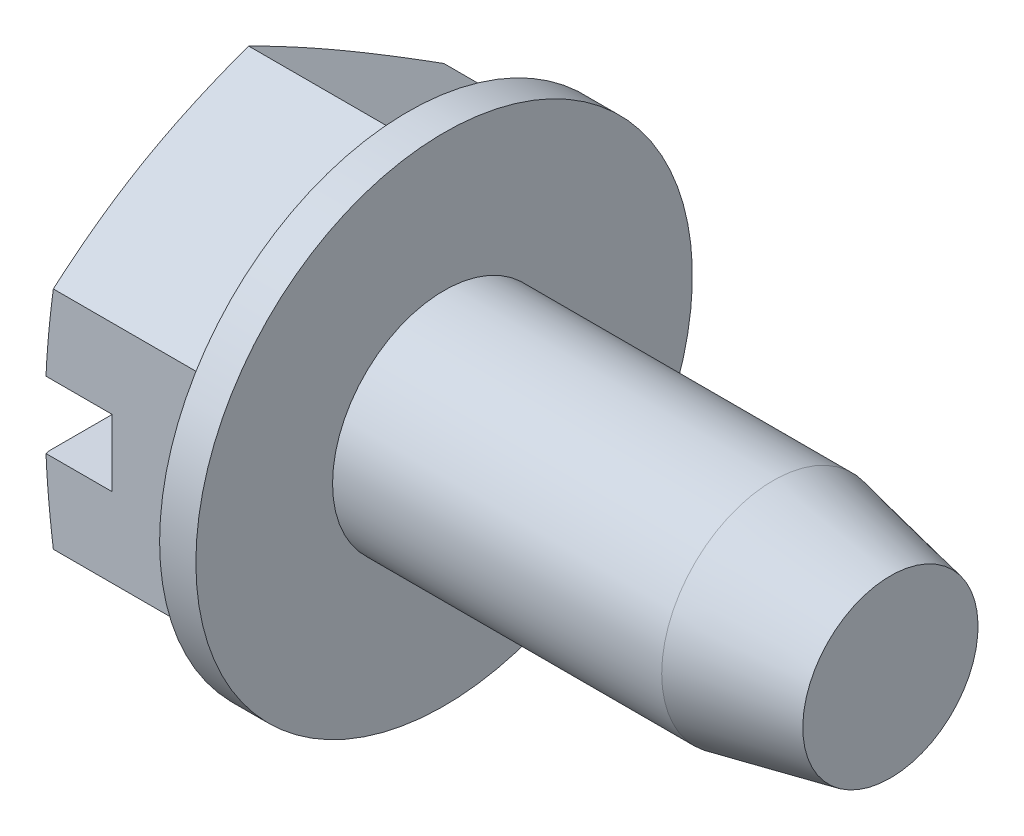
ISO-10303-21;
HEADER;
FILE_DESCRIPTION(('STEP AP214'),'2;1');
FILE_NAME('part.step','',(''),(''),'','','');
FILE_SCHEMA(('AUTOMOTIVE_DESIGN { 1 0 10303 214 1 1 1 1 }'));
ENDSEC;
DATA;
#1=APPLICATION_CONTEXT('core data for automotive mechanical design processes');
#2=APPLICATION_PROTOCOL_DEFINITION('international standard','automotive_design',2000,#1);
#3=PRODUCT_CONTEXT('',#1,'mechanical');
#4=PRODUCT('Part','Part','',(#3));
#5=PRODUCT_RELATED_PRODUCT_CATEGORY('part','',(#4));
#6=PRODUCT_DEFINITION_FORMATION('','',#4);
#7=PRODUCT_DEFINITION_CONTEXT('part definition',#1,'design');
#8=PRODUCT_DEFINITION('design','',#6,#7);
#9=PRODUCT_DEFINITION_SHAPE('','',#8);
#10=(LENGTH_UNIT() NAMED_UNIT(*) SI_UNIT(.MILLI.,.METRE.));
#11=(NAMED_UNIT(*) PLANE_ANGLE_UNIT() SI_UNIT($,.RADIAN.));
#12=(NAMED_UNIT(*) SI_UNIT($,.STERADIAN.) SOLID_ANGLE_UNIT());
#13=UNCERTAINTY_MEASURE_WITH_UNIT(LENGTH_MEASURE(1.E-05),#10,'distance_accuracy_value','');
#14=(GEOMETRIC_REPRESENTATION_CONTEXT(3) GLOBAL_UNCERTAINTY_ASSIGNED_CONTEXT((#13)) GLOBAL_UNIT_ASSIGNED_CONTEXT((#10,
#11,#12)) REPRESENTATION_CONTEXT('',''));
#15=CARTESIAN_POINT('',(0.,0.,0.));
#16=DIRECTION('',(0.,0.,1.));
#17=DIRECTION('',(1.,0.,0.));
#18=AXIS2_PLACEMENT_3D('',#15,#16,#17);
#19=CARTESIAN_POINT('',(-2.45,0.,0.));
#20=DIRECTION('',(-1.,0.,0.));
#21=DIRECTION('',(0.,0.,1.));
#22=AXIS2_PLACEMENT_3D('',#19,#20,#21);
#23=PLANE('',#22);
#24=DIRECTION('',(0.,0.,1.));
#25=VECTOR('',#24,1.);
#26=CARTESIAN_POINT('',(-2.45,0.6,4.));
#27=LINE('',#26,#25);
#28=CARTESIAN_POINT('',(-2.45,0.6,3.5));
#29=VERTEX_POINT('',#28);
#30=CARTESIAN_POINT('',(-2.45,0.6,-3.5));
#31=VERTEX_POINT('',#30);
#32=EDGE_CURVE('E132',#29,#31,#27,.F.);
#33=ORIENTED_EDGE('',*,*,#32,.T.);
#34=DIRECTION('',(0.,1.,0.));
#35=VECTOR('',#34,1.);
#36=CARTESIAN_POINT('',(-2.45,0.,-3.5));
#37=LINE('',#36,#35);
#38=CARTESIAN_POINT('',(-2.45,-0.6,-3.5));
#39=VERTEX_POINT('',#38);
#40=EDGE_CURVE('E127',#31,#39,#37,.F.);
#41=ORIENTED_EDGE('',*,*,#40,.T.);
#42=DIRECTION('',(0.,0.,-1.));
#43=VECTOR('',#42,1.);
#44=CARTESIAN_POINT('',(-2.45,-0.6,-4.));
#45=LINE('',#44,#43);
#46=CARTESIAN_POINT('',(-2.45,-0.6,3.5));
#47=VERTEX_POINT('',#46);
#48=EDGE_CURVE('E395',#39,#47,#45,.F.);
#49=ORIENTED_EDGE('',*,*,#48,.T.);
#50=DIRECTION('',(0.,1.,0.));
#51=VECTOR('',#50,1.);
#52=CARTESIAN_POINT('',(-2.45,0.,3.5));
#53=LINE('',#52,#51);
#54=EDGE_CURVE('E403',#47,#29,#53,.T.);
#55=ORIENTED_EDGE('',*,*,#54,.T.);
#56=EDGE_LOOP('',(#33,#41,#49,#55));
#57=FACE_BOUND('',#56,.T.);
#58=ADVANCED_FACE('F17',(#57),#23,.T.);
#59=CARTESIAN_POINT('',(-2.45,0.6,4.));
#60=DIRECTION('',(0.,1.,0.));
#61=DIRECTION('',(0.,0.,1.));
#62=AXIS2_PLACEMENT_3D('',#59,#60,#61);
#63=PLANE('',#62);
#64=CARTESIAN_POINT('',(-3.64999999998839,0.6,3.44818792990551));
#65=CARTESIAN_POINT('',(-3.6477203832953,0.6,3.45682339648026));
#66=CARTESIAN_POINT('',(-3.64544053641155,0.6,3.46545880227545));
#67=CARTESIAN_POINT('',(-3.64088038226275,0.6,3.48272949230663));
#68=CARTESIAN_POINT('',(-3.63860007499771,0.6,3.49136477654262));
#69=CARTESIAN_POINT('',(-3.636319537542,0.6,3.49999999999905));
#70=B_SPLINE_CURVE_WITH_KNOTS('',3,(#64,#65,#66,#67,#68,#69),.UNSPECIFIED.,.F.,.F.,(4,2,4),(0.,
0.0267938689917817,0.053587737983288),.UNSPECIFIED.);
#71=CARTESIAN_POINT('',(-3.64999999999083,0.6,3.44818792989627));
#72=VERTEX_POINT('',#71);
#73=CARTESIAN_POINT('',(-3.63631953754188,0.599999999999913,3.49999999999953));
#74=VERTEX_POINT('',#73);
#75=EDGE_CURVE('E148',#72,#74,#70,.T.);
#76=ORIENTED_EDGE('',*,*,#75,.F.);
#77=DIRECTION('',(0.,0.,-1.));
#78=VECTOR('',#77,1.);
#79=CARTESIAN_POINT('',(-3.65,0.6,0.));
#80=LINE('',#79,#78);
#81=CARTESIAN_POINT('',(-3.64999999999083,0.6,-3.44818792989627));
#82=VERTEX_POINT('',#81);
#83=EDGE_CURVE('E146',#72,#82,#80,.T.);
#84=ORIENTED_EDGE('',*,*,#83,.T.);
#85=CARTESIAN_POINT('',(-3.63631953754283,0.6,-3.49999999999591));
#86=CARTESIAN_POINT('',(-3.6386000749984,0.6,-3.49136477654));
#87=CARTESIAN_POINT('',(-3.64088038226331,0.6,-3.48272949230454));
#88=CARTESIAN_POINT('',(-3.64544053641183,0.6,-3.46545880227441));
#89=CARTESIAN_POINT('',(-3.64772038329544,0.6,-3.45682339647974));
#90=CARTESIAN_POINT('',(-3.64999999998839,0.6,-3.44818792990551));
#91=B_SPLINE_CURVE_WITH_KNOTS('',3,(#85,#86,#87,#88,#89,#90),.UNSPECIFIED.,.F.,.F.,(4,2,4),(0.,
0.0267938689898805,0.0535877379800368),.UNSPECIFIED.);
#92=CARTESIAN_POINT('',(-3.63631953754177,0.599999999999626,-3.5));
#93=VERTEX_POINT('',#92);
#94=EDGE_CURVE('E20',#93,#82,#91,.T.);
#95=ORIENTED_EDGE('',*,*,#94,.F.);
#96=DIRECTION('',(1.,0.,0.));
#97=VECTOR('',#96,1.);
#98=CARTESIAN_POINT('',(-2.45,0.6,-3.5));
#99=LINE('',#98,#97);
#100=EDGE_CURVE('E120',#31,#93,#99,.F.);
#101=ORIENTED_EDGE('',*,*,#100,.F.);
#102=ORIENTED_EDGE('',*,*,#32,.F.);
#103=DIRECTION('',(1.,0.,0.));
#104=VECTOR('',#103,1.);
#105=CARTESIAN_POINT('',(-2.45,0.6,3.5));
#106=LINE('',#105,#104);
#107=EDGE_CURVE('E149',#74,#29,#106,.T.);
#108=ORIENTED_EDGE('',*,*,#107,.F.);
#109=EDGE_LOOP('',(#76,#84,#95,#101,#102,#108));
#110=FACE_BOUND('',#109,.T.);
#111=ADVANCED_FACE('F144',(#110),#63,.F.);
#112=CARTESIAN_POINT('',(-2.45,-0.6,-4.));
#113=DIRECTION('',(0.,-1.,0.));
#114=DIRECTION('',(0.,0.,-1.));
#115=AXIS2_PLACEMENT_3D('',#112,#113,#114);
#116=PLANE('',#115);
#117=ORIENTED_EDGE('',*,*,#48,.F.);
#118=DIRECTION('',(1.,0.,0.));
#119=VECTOR('',#118,1.);
#120=CARTESIAN_POINT('',(-2.45,-0.6,-3.5));
#121=LINE('',#120,#119);
#122=CARTESIAN_POINT('',(-3.63631953754188,-0.599999999999914,-3.49999999999953));
#123=VERTEX_POINT('',#122);
#124=EDGE_CURVE('E400',#123,#39,#121,.T.);
#125=ORIENTED_EDGE('',*,*,#124,.F.);
#126=CARTESIAN_POINT('',(-3.64999999998839,-0.6,-3.44818792990551));
#127=CARTESIAN_POINT('',(-3.6477203832953,-0.6,-3.45682339648026));
#128=CARTESIAN_POINT('',(-3.64544053641155,-0.6,-3.46545880227545));
#129=CARTESIAN_POINT('',(-3.64088038226275,-0.6,-3.48272949230663));
#130=CARTESIAN_POINT('',(-3.63860007499771,-0.6,-3.49136477654262));
#131=CARTESIAN_POINT('',(-3.636319537542,-0.6,-3.49999999999905));
#132=B_SPLINE_CURVE_WITH_KNOTS('',3,(#126,#127,#128,#129,#130,#131),.UNSPECIFIED.,.F.,.F.,(4,2,
4),(0.,0.0267938689917821,0.0535877379832885),.UNSPECIFIED.);
#133=CARTESIAN_POINT('',(-3.64999999999083,-0.6,-3.44818792989627));
#134=VERTEX_POINT('',#133);
#135=EDGE_CURVE('E411',#134,#123,#132,.T.);
#136=ORIENTED_EDGE('',*,*,#135,.F.);
#137=DIRECTION('',(0.,0.,-1.));
#138=VECTOR('',#137,1.);
#139=CARTESIAN_POINT('',(-3.65,-0.6,0.));
#140=LINE('',#139,#138);
#141=CARTESIAN_POINT('',(-3.64999999999083,-0.6,3.44818792989627));
#142=VERTEX_POINT('',#141);
#143=EDGE_CURVE('E388',#134,#142,#140,.F.);
#144=ORIENTED_EDGE('',*,*,#143,.T.);
#145=CARTESIAN_POINT('',(-3.63631953754283,-0.6,3.49999999999591));
#146=CARTESIAN_POINT('',(-3.6386000749984,-0.6,3.49136477654));
#147=CARTESIAN_POINT('',(-3.64088038226331,-0.6,3.48272949230454));
#148=CARTESIAN_POINT('',(-3.64544053641183,-0.6,3.46545880227441));
#149=CARTESIAN_POINT('',(-3.64772038329544,-0.6,3.45682339647974));
#150=CARTESIAN_POINT('',(-3.64999999998839,-0.6,3.44818792990551));
#151=B_SPLINE_CURVE_WITH_KNOTS('',3,(#145,#146,#147,#148,#149,#150),.UNSPECIFIED.,.F.,.F.,(4,2,
4),(0.,0.0267938689898805,0.0535877379800368),.UNSPECIFIED.);
#152=CARTESIAN_POINT('',(-3.63631953754177,-0.599999999999625,3.5));
#153=VERTEX_POINT('',#152);
#154=EDGE_CURVE('E154',#153,#142,#151,.T.);
#155=ORIENTED_EDGE('',*,*,#154,.F.);
#156=DIRECTION('',(1.,0.,0.));
#157=VECTOR('',#156,1.);
#158=CARTESIAN_POINT('',(-2.45,-0.6,3.5));
#159=LINE('',#158,#157);
#160=EDGE_CURVE('E393',#47,#153,#159,.F.);
#161=ORIENTED_EDGE('',*,*,#160,.F.);
#162=EDGE_LOOP('',(#117,#125,#136,#144,#155,#161));
#163=FACE_BOUND('',#162,.T.);
#164=ADVANCED_FACE('F446',(#163),#116,.F.);
#165=CARTESIAN_POINT('',(-3.65,0.,0.));
#166=DIRECTION('',(1.,0.,0.));
#167=DIRECTION('',(0.,0.,-1.));
#168=AXIS2_PLACEMENT_3D('',#165,#166,#167);
#169=PLANE('',#168);
#170=CARTESIAN_POINT('',(-3.64999999999327,0.,0.));
#171=DIRECTION('',(1.,0.,0.));
#172=DIRECTION('',(0.,0.,-1.));
#173=AXIS2_PLACEMENT_3D('',#170,#171,#172);
#174=CIRCLE('',#173,3.49999999997408);
#175=CARTESIAN_POINT('',(-3.6499999999898,3.03108891323431,-1.74999999999352));
#176=VERTEX_POINT('',#175);
#177=EDGE_CURVE('E437',#82,#176,#174,.T.);
#178=ORIENTED_EDGE('',*,*,#177,.F.);
#179=ORIENTED_EDGE('',*,*,#83,.F.);
#180=CARTESIAN_POINT('',(-3.64999999999327,0.,0.));
#181=DIRECTION('',(1.,0.,0.));
#182=DIRECTION('',(0.,0.,-1.));
#183=AXIS2_PLACEMENT_3D('',#180,#181,#182);
#184=CIRCLE('',#183,3.49999999997408);
#185=CARTESIAN_POINT('',(-3.6499999999898,3.03108891323431,1.74999999999352));
#186=VERTEX_POINT('',#185);
#187=EDGE_CURVE('E431',#186,#72,#184,.T.);
#188=ORIENTED_EDGE('',*,*,#187,.F.);
#189=CARTESIAN_POINT('',(-3.64999999999327,0.,0.));
#190=DIRECTION('',(1.,0.,0.));
#191=DIRECTION('',(0.,0.,-1.));
#192=AXIS2_PLACEMENT_3D('',#189,#190,#191);
#193=CIRCLE('',#192,3.49999999997408);
#194=EDGE_CURVE('E435',#176,#186,#193,.T.);
#195=ORIENTED_EDGE('',*,*,#194,.F.);
#196=EDGE_LOOP('',(#178,#179,#188,#195));
#197=FACE_BOUND('',#196,.T.);
#198=ADVANCED_FACE('F449',(#197),#169,.F.);
#199=CARTESIAN_POINT('',(-3.65,0.,0.));
#200=DIRECTION('',(1.,0.,0.));
#201=DIRECTION('',(0.,0.,-1.));
#202=AXIS2_PLACEMENT_3D('',#199,#200,#201);
#203=PLANE('',#202);
#204=ORIENTED_EDGE('',*,*,#143,.F.);
#205=CARTESIAN_POINT('',(-3.64999999999327,0.,0.));
#206=DIRECTION('',(1.,0.,0.));
#207=DIRECTION('',(0.,0.,-1.));
#208=AXIS2_PLACEMENT_3D('',#205,#206,#207);
#209=CIRCLE('',#208,3.49999999997408);
#210=CARTESIAN_POINT('',(-3.6499999999898,-3.03108891323431,-1.74999999999352));
#211=VERTEX_POINT('',#210);
#212=EDGE_CURVE('E391',#211,#134,#209,.T.);
#213=ORIENTED_EDGE('',*,*,#212,.F.);
#214=CARTESIAN_POINT('',(-3.64999999999327,0.,0.));
#215=DIRECTION('',(1.,0.,0.));
#216=DIRECTION('',(0.,0.,-1.));
#217=AXIS2_PLACEMENT_3D('',#214,#215,#216);
#218=CIRCLE('',#217,3.49999999997408);
#219=CARTESIAN_POINT('',(-3.6499999999898,-3.03108891323431,1.74999999999352));
#220=VERTEX_POINT('',#219);
#221=EDGE_CURVE('E434',#220,#211,#218,.T.);
#222=ORIENTED_EDGE('',*,*,#221,.F.);
#223=CARTESIAN_POINT('',(-3.64999999999327,0.,0.));
#224=DIRECTION('',(1.,0.,0.));
#225=DIRECTION('',(0.,0.,-1.));
#226=AXIS2_PLACEMENT_3D('',#223,#224,#225);
#227=CIRCLE('',#226,3.49999999997408);
#228=EDGE_CURVE('E432',#142,#220,#227,.T.);
#229=ORIENTED_EDGE('',*,*,#228,.F.);
#230=EDGE_LOOP('',(#204,#213,#222,#229));
#231=FACE_BOUND('',#230,.T.);
#232=ADVANCED_FACE('F245',(#231),#203,.F.);
#233=CARTESIAN_POINT('',(-3.50404791527126,0.,0.));
#234=DIRECTION('',(1.,0.,0.));
#235=DIRECTION('',(0.,0.,-1.));
#236=AXIS2_PLACEMENT_3D('',#233,#234,#235);
#237=CONICAL_SURFACE('',#236,4.0447005956139,1.30899693898963);
#238=CARTESIAN_POINT('',(-3.63631953754176,-0.599999999999827,-3.5));
#239=CARTESIAN_POINT('',(-3.63094898573934,-0.718854864572353,-3.5));
#240=CARTESIAN_POINT('',(-3.62400732215217,-0.837632259910194,-3.5));
#241=CARTESIAN_POINT('',(-3.60724361066372,-1.07492649052611,-3.5));
#242=CARTESIAN_POINT('',(-3.59742296761133,-1.19344342454946,-3.5));
#243=CARTESIAN_POINT('',(-3.57515839405998,-1.43021644614016,-3.5));
#244=CARTESIAN_POINT('',(-3.56271469762457,-1.54847255603093,-3.5));
#245=CARTESIAN_POINT('',(-3.53549309317859,-1.78477520749025,-3.5));
#246=CARTESIAN_POINT('',(-3.52071405000704,-1.90282161876334,-3.5));
#247=CARTESIAN_POINT('',(-3.50491841778354,-2.02072584552902,-3.5));
#248=B_SPLINE_CURVE_WITH_KNOTS('',3,(#238,#239,#240,#241,#242,#243,#244,#245,#246,#247),
.UNSPECIFIED.,.F.,.F.,(4,2,2,2,4),(0.,0.356908841388267,0.713643811876487,1.07034696321185,
1.42722403654318),.UNSPECIFIED.);
#249=CARTESIAN_POINT('',(-3.50491840824556,-2.02072588240884,-3.50000001981037));
#250=VERTEX_POINT('',#249);
#251=EDGE_CURVE('E251',#123,#250,#248,.T.);
#252=ORIENTED_EDGE('',*,*,#251,.T.);
#253=CARTESIAN_POINT('',(-3.64999999998632,-3.03108891324553,-1.75));
#254=CARTESIAN_POINT('',(-3.65000384449199,-2.98881911471446,-1.82321343868152));
#255=CARTESIAN_POINT('',(-3.64917891624973,-2.9465505066051,-1.89642481549216));
#256=CARTESIAN_POINT('',(-3.64590404446093,-2.86203034030094,-2.04281803779514));
#257=CARTESIAN_POINT('',(-3.64345415319576,-2.81977878160136,-2.11599988416179));
#258=CARTESIAN_POINT('',(-3.6337233166193,-2.69316610889181,-2.33529946617682));
#259=CARTESIAN_POINT('',(-3.62406106156112,-2.60884835585777,-2.48134209841181));
#260=CARTESIAN_POINT('',(-3.59897707485568,-2.44045525420246,-2.77300750612292));
#261=CARTESIAN_POINT('',(-3.58355670140099,-2.35637985312552,-2.9186303724549));
#262=CARTESIAN_POINT('',(-3.54775556526411,-2.18839462960489,-3.20958931451345));
#263=CARTESIAN_POINT('',(-3.52736917208543,-2.10448510487288,-3.35492487458826));
#264=CARTESIAN_POINT('',(-3.50491839930019,-2.02072592150024,-3.50000003579014));
#265=B_SPLINE_CURVE_WITH_KNOTS('',3,(#253,#254,#255,#256,#257,#258,#259,#260,#261,#262,#263,
#264),.UNSPECIFIED.,.F.,.F.,(4,2,2,2,2,4),(0.,0.253610256298059,0.507212353362531,
1.01382508489736,1.52031839487754,2.02738866432494),.UNSPECIFIED.);
#266=EDGE_CURVE('E142',#211,#250,#265,.T.);
#267=ORIENTED_EDGE('',*,*,#266,.F.);
#268=ORIENTED_EDGE('',*,*,#212,.T.);
#269=ORIENTED_EDGE('',*,*,#135,.T.);
#270=EDGE_LOOP('',(#252,#267,#268,#269));
#271=FACE_BOUND('',#270,.T.);
#272=ADVANCED_FACE('F239',(#271),#237,.T.);
#273=CARTESIAN_POINT('',(-3.50404791527126,0.,0.));
#274=DIRECTION('',(1.,0.,0.));
#275=DIRECTION('',(0.,0.,-1.));
#276=AXIS2_PLACEMENT_3D('',#273,#274,#275);
#277=CONICAL_SURFACE('',#276,4.0447005956139,1.30899693898963);
#278=ORIENTED_EDGE('',*,*,#177,.T.);
#279=CARTESIAN_POINT('',(-3.5049184048406,2.02072594216828,-3.50000000000055));
#280=CARTESIAN_POINT('',(-3.52736917682474,2.10448512383824,-3.35492484174233));
#281=CARTESIAN_POINT('',(-3.54775556925207,2.1883946468626,-3.20958928462304));
#282=CARTESIAN_POINT('',(-3.58355670404108,2.35637986696147,-2.91863034848953));
#283=CARTESIAN_POINT('',(-3.59897707689891,2.44045526632432,-2.77300748512702));
#284=CARTESIAN_POINT('',(-3.62406106261669,2.60884836453704,-2.48134208337909));
#285=CARTESIAN_POINT('',(-3.63372331728421,2.69316611584257,-2.33529945413779));
#286=CARTESIAN_POINT('',(-3.64345415346456,2.81977878595163,-2.11599987662687));
#287=CARTESIAN_POINT('',(-3.64590404462932,2.86203034378183,-2.04281803176603));
#288=CARTESIAN_POINT('',(-3.64917891628357,2.94655050834614,-1.89642481247659));
#289=CARTESIAN_POINT('',(-3.65000384449169,2.98881911558503,-1.82321343717367));
#290=CARTESIAN_POINT('',(-3.64999999998632,3.03108891324554,-1.75));
#291=B_SPLINE_CURVE_WITH_KNOTS('',3,(#279,#280,#281,#282,#283,#284,#285,#286,#287,#288,#289,
#290),.UNSPECIFIED.,.F.,.F.,(4,2,2,2,2,4),(0.,0.507070259014371,1.01356355859123,
1.52017627971235,1.77377837155486,2.0273886226301),.UNSPECIFIED.);
#292=CARTESIAN_POINT('',(-3.50491840483725,2.02072594216312,-3.49999999999902));
#293=VERTEX_POINT('',#292);
#294=EDGE_CURVE('E140',#293,#176,#291,.T.);
#295=ORIENTED_EDGE('',*,*,#294,.F.);
#296=CARTESIAN_POINT('',(-3.63631953754473,0.599999999999385,-3.50000000000383));
#297=CARTESIAN_POINT('',(-3.63094898537516,0.718854872696004,-3.50000000000138));
#298=CARTESIAN_POINT('',(-3.62400732120488,0.837632276146353,-3.50000000000037));
#299=CARTESIAN_POINT('',(-3.60724360817486,1.07492652294599,-3.49999999999963));
#300=CARTESIAN_POINT('',(-3.59742296416434,1.19344346504059,-3.49999999999989));
#301=CARTESIAN_POINT('',(-3.57515838837717,1.43021650273193,-3.50000000000011));
#302=CARTESIAN_POINT('',(-3.56271469066416,1.54847262065211,-3.50000000000005));
#303=CARTESIAN_POINT('',(-3.53549308340394,1.7847752881414,-3.49999999999995));
#304=CARTESIAN_POINT('',(-3.52071403869551,1.90282170741501,-3.49999999999989));
#305=CARTESIAN_POINT('',(-3.50491840483721,2.02072594216172,-3.5));
#306=B_SPLINE_CURVE_WITH_KNOTS('',3,(#296,#297,#298,#299,#300,#301,#302,#303,#304,#305),
.UNSPECIFIED.,.F.,.F.,(4,2,2,2,4),(0.,0.356908865780689,0.713643860630752,1.07034703631944,
1.42722413403468),.UNSPECIFIED.);
#307=EDGE_CURVE('E124',#93,#293,#306,.T.);
#308=ORIENTED_EDGE('',*,*,#307,.F.);
#309=ORIENTED_EDGE('',*,*,#94,.T.);
#310=EDGE_LOOP('',(#278,#295,#308,#309));
#311=FACE_BOUND('',#310,.T.);
#312=ADVANCED_FACE('F137',(#311),#277,.T.);
#313=CARTESIAN_POINT('',(-3.50404791527126,0.,0.));
#314=DIRECTION('',(1.,0.,0.));
#315=DIRECTION('',(0.,0.,-1.));
#316=AXIS2_PLACEMENT_3D('',#313,#314,#315);
#317=CONICAL_SURFACE('',#316,4.0447005956139,1.30899693898963);
#318=CARTESIAN_POINT('',(-3.64999999998632,3.03108891324554,-1.75));
#319=CARTESIAN_POINT('',(-3.65000384449168,3.07335871090606,-1.67678656282631));
#320=CARTESIAN_POINT('',(-3.64917891628357,3.11562731814495,-1.60357518752338));
#321=CARTESIAN_POINT('',(-3.64590404462932,3.20014748270927,-1.4571819682339));
#322=CARTESIAN_POINT('',(-3.64345415346456,3.24239904053947,-1.38400012337305));
#323=CARTESIAN_POINT('',(-3.63372331728419,3.36901171064858,-1.16470054586213));
#324=CARTESIAN_POINT('',(-3.6240610626166,3.45332946195418,-1.01865791662087));
#325=CARTESIAN_POINT('',(-3.59897707689898,3.62172256016675,-0.726992514872767));
#326=CARTESIAN_POINT('',(-3.58355670404138,3.70579795952937,-0.581369651510055));
#327=CARTESIAN_POINT('',(-3.54775556925171,3.87378317962895,-0.290410715376939));
#328=CARTESIAN_POINT('',(-3.52736917682349,3.95769270265425,-0.145075158258251));
#329=CARTESIAN_POINT('',(-3.50491840483719,4.04145188432647,-1.5740279371775E-12));
#330=B_SPLINE_CURVE_WITH_KNOTS('',3,(#318,#319,#320,#321,#322,#323,#324,#325,#326,#327,#328,
#329),.UNSPECIFIED.,.F.,.F.,(4,2,2,2,2,4),(0.,0.253610251075294,0.507212342917842,
1.013825064039,1.52031836361597,2.0273886226305),.UNSPECIFIED.);
#331=CARTESIAN_POINT('',(-3.50491840483725,4.04145188432625,0.));
#332=VERTEX_POINT('',#331);
#333=EDGE_CURVE('E224',#176,#332,#330,.T.);
#334=ORIENTED_EDGE('',*,*,#333,.F.);
#335=ORIENTED_EDGE('',*,*,#194,.T.);
#336=CARTESIAN_POINT('',(-3.5049184048406,4.04145188433015,3.69849026708838E-12));
#337=CARTESIAN_POINT('',(-3.52736917682474,3.95769270265547,0.145075158259192));
#338=CARTESIAN_POINT('',(-3.54775556925207,3.87378317962918,0.290410715377369));
#339=CARTESIAN_POINT('',(-3.58355670404108,3.7057979595289,0.581369651510065));
#340=CARTESIAN_POINT('',(-3.59897707689891,3.62172256016656,0.726992514872869));
#341=CARTESIAN_POINT('',(-3.62406106261669,3.45332946195421,1.01865791662102));
#342=CARTESIAN_POINT('',(-3.63372331728421,3.36901171064854,1.16470054586223));
#343=CARTESIAN_POINT('',(-3.64345415346456,3.24239904053942,1.38400012337312));
#344=CARTESIAN_POINT('',(-3.64590404462932,3.20014748270923,1.45718196823396));
#345=CARTESIAN_POINT('',(-3.64917891628357,3.11562731814494,1.60357518752341));
#346=CARTESIAN_POINT('',(-3.65000384449168,3.07335871090606,1.67678656282634));
#347=CARTESIAN_POINT('',(-3.64999999998632,3.03108891324553,1.75));
#348=B_SPLINE_CURVE_WITH_KNOTS('',3,(#336,#337,#338,#339,#340,#341,#342,#343,#344,#345,#346,
#347),.UNSPECIFIED.,.F.,.F.,(4,2,2,2,2,4),(0.,0.50707025901437,1.01356355859123,
1.52017627971235,1.77377837155485,2.0273886226301),.UNSPECIFIED.);
#349=EDGE_CURVE('E197',#332,#186,#348,.T.);
#350=ORIENTED_EDGE('',*,*,#349,.F.);
#351=EDGE_LOOP('',(#334,#335,#350));
#352=FACE_BOUND('',#351,.T.);
#353=ADVANCED_FACE('F173',(#352),#317,.T.);
#354=CARTESIAN_POINT('',(-3.50404791527126,0.,0.));
#355=DIRECTION('',(1.,0.,0.));
#356=DIRECTION('',(0.,0.,-1.));
#357=AXIS2_PLACEMENT_3D('',#354,#355,#356);
#358=CONICAL_SURFACE('',#357,4.0447005956139,1.30899693898963);
#359=CARTESIAN_POINT('',(-3.63631953754176,0.599999999999827,3.5));
#360=CARTESIAN_POINT('',(-3.63094898573934,0.718854864572352,3.5));
#361=CARTESIAN_POINT('',(-3.62400732215217,0.837632259910193,3.5));
#362=CARTESIAN_POINT('',(-3.60724361066372,1.07492649052611,3.5));
#363=CARTESIAN_POINT('',(-3.59742296761133,1.19344342454946,3.5));
#364=CARTESIAN_POINT('',(-3.57515839405998,1.43021644614016,3.5));
#365=CARTESIAN_POINT('',(-3.56271469762457,1.54847255603093,3.5));
#366=CARTESIAN_POINT('',(-3.53549309317859,1.78477520749025,3.5));
#367=CARTESIAN_POINT('',(-3.52071405000704,1.90282161876334,3.5));
#368=CARTESIAN_POINT('',(-3.50491841778354,2.02072584552902,3.5));
#369=B_SPLINE_CURVE_WITH_KNOTS('',3,(#359,#360,#361,#362,#363,#364,#365,#366,#367,#368),
.UNSPECIFIED.,.F.,.F.,(4,2,2,2,4),(0.,0.356908841388267,0.713643811876487,1.07034696321185,
1.42722403654318),.UNSPECIFIED.);
#370=CARTESIAN_POINT('',(-3.50491840824556,2.02072588240884,3.50000001981037));
#371=VERTEX_POINT('',#370);
#372=EDGE_CURVE('E180',#74,#371,#369,.T.);
#373=ORIENTED_EDGE('',*,*,#372,.T.);
#374=CARTESIAN_POINT('',(-3.64999999998632,3.03108891324553,1.75));
#375=CARTESIAN_POINT('',(-3.65000384449199,2.98881911471446,1.82321343868152));
#376=CARTESIAN_POINT('',(-3.64917891624973,2.94655050660509,1.89642481549216));
#377=CARTESIAN_POINT('',(-3.64590404446092,2.86203034030093,2.04281803779514));
#378=CARTESIAN_POINT('',(-3.64345415319576,2.81977878160135,2.11599988416179));
#379=CARTESIAN_POINT('',(-3.6337233166193,2.69316610889181,2.33529946617682));
#380=CARTESIAN_POINT('',(-3.62406106156112,2.60884835585777,2.48134209841182));
#381=CARTESIAN_POINT('',(-3.59897707485568,2.44045525420246,2.77300750612292));
#382=CARTESIAN_POINT('',(-3.58355670140099,2.35637985312552,2.9186303724549));
#383=CARTESIAN_POINT('',(-3.54775556526411,2.18839462960489,3.20958931451345));
#384=CARTESIAN_POINT('',(-3.52736917208543,2.10448510487288,3.35492487458826));
#385=CARTESIAN_POINT('',(-3.50491839930019,2.02072592150024,3.50000003579015));
#386=B_SPLINE_CURVE_WITH_KNOTS('',3,(#374,#375,#376,#377,#378,#379,#380,#381,#382,#383,#384,
#385),.UNSPECIFIED.,.F.,.F.,(4,2,2,2,2,4),(0.,0.25361025629806,0.507212353362531,
1.01382508489736,1.52031839487754,2.02738866432494),.UNSPECIFIED.);
#387=EDGE_CURVE('E188',#186,#371,#386,.T.);
#388=ORIENTED_EDGE('',*,*,#387,.F.);
#389=ORIENTED_EDGE('',*,*,#187,.T.);
#390=ORIENTED_EDGE('',*,*,#75,.T.);
#391=EDGE_LOOP('',(#373,#388,#389,#390));
#392=FACE_BOUND('',#391,.T.);
#393=ADVANCED_FACE('F168',(#392),#358,.T.);
#394=CARTESIAN_POINT('',(-3.50404791527126,0.,0.));
#395=DIRECTION('',(1.,0.,0.));
#396=DIRECTION('',(0.,0.,-1.));
#397=AXIS2_PLACEMENT_3D('',#394,#395,#396);
#398=CONICAL_SURFACE('',#397,4.0447005956139,1.30899693898963);
#399=ORIENTED_EDGE('',*,*,#228,.T.);
#400=CARTESIAN_POINT('',(-3.5049184048406,-2.02072594216828,3.50000000000055));
#401=CARTESIAN_POINT('',(-3.52736917682474,-2.10448512383824,3.35492484174233));
#402=CARTESIAN_POINT('',(-3.54775556925207,-2.1883946468626,3.20958928462304));
#403=CARTESIAN_POINT('',(-3.58355670404108,-2.35637986696147,2.91863034848953));
#404=CARTESIAN_POINT('',(-3.59897707689891,-2.44045526632432,2.77300748512702));
#405=CARTESIAN_POINT('',(-3.62406106261669,-2.60884836453704,2.48134208337909));
#406=CARTESIAN_POINT('',(-3.63372331728421,-2.69316611584257,2.33529945413779));
#407=CARTESIAN_POINT('',(-3.64345415346456,-2.81977878595163,2.11599987662687));
#408=CARTESIAN_POINT('',(-3.64590404462932,-2.86203034378183,2.04281803176603));
#409=CARTESIAN_POINT('',(-3.64917891628357,-2.94655050834614,1.89642481247659));
#410=CARTESIAN_POINT('',(-3.65000384449169,-2.98881911558503,1.82321343717368));
#411=CARTESIAN_POINT('',(-3.64999999998632,-3.03108891324554,1.75));
#412=B_SPLINE_CURVE_WITH_KNOTS('',3,(#400,#401,#402,#403,#404,#405,#406,#407,#408,#409,#410,
#411),.UNSPECIFIED.,.F.,.F.,(4,2,2,2,2,4),(0.,0.507070259014371,1.01356355859123,
1.52017627971235,1.77377837155485,2.0273886226301),.UNSPECIFIED.);
#413=CARTESIAN_POINT('',(-3.50491840483725,-2.02072594216312,3.49999999999902));
#414=VERTEX_POINT('',#413);
#415=EDGE_CURVE('E285',#414,#220,#412,.T.);
#416=ORIENTED_EDGE('',*,*,#415,.F.);
#417=CARTESIAN_POINT('',(-3.63631953754473,-0.599999999999384,3.50000000000383));
#418=CARTESIAN_POINT('',(-3.63094898537516,-0.718854872696003,3.50000000000138));
#419=CARTESIAN_POINT('',(-3.62400732120488,-0.837632276146353,3.50000000000037));
#420=CARTESIAN_POINT('',(-3.60724360817486,-1.07492652294599,3.49999999999963));
#421=CARTESIAN_POINT('',(-3.59742296416434,-1.19344346504059,3.49999999999989));
#422=CARTESIAN_POINT('',(-3.57515838837717,-1.43021650273193,3.50000000000011));
#423=CARTESIAN_POINT('',(-3.56271469066416,-1.54847262065211,3.50000000000005));
#424=CARTESIAN_POINT('',(-3.53549308340394,-1.7847752881414,3.49999999999995));
#425=CARTESIAN_POINT('',(-3.52071403869551,-1.90282170741501,3.49999999999989));
#426=CARTESIAN_POINT('',(-3.50491840483721,-2.02072594216172,3.5));
#427=B_SPLINE_CURVE_WITH_KNOTS('',3,(#417,#418,#419,#420,#421,#422,#423,#424,#425,#426),
.UNSPECIFIED.,.F.,.F.,(4,2,2,2,4),(0.,0.356908865780689,0.713643860630752,1.07034703631944,
1.42722413403468),.UNSPECIFIED.);
#428=EDGE_CURVE('E198',#153,#414,#427,.T.);
#429=ORIENTED_EDGE('',*,*,#428,.F.);
#430=ORIENTED_EDGE('',*,*,#154,.T.);
#431=EDGE_LOOP('',(#399,#416,#429,#430));
#432=FACE_BOUND('',#431,.T.);
#433=ADVANCED_FACE('F172',(#432),#398,.T.);
#434=CARTESIAN_POINT('',(-3.50404791527126,0.,0.));
#435=DIRECTION('',(1.,0.,0.));
#436=DIRECTION('',(0.,0.,-1.));
#437=AXIS2_PLACEMENT_3D('',#434,#435,#436);
#438=CONICAL_SURFACE('',#437,4.0447005956139,1.30899693898963);
#439=CARTESIAN_POINT('',(-3.64999999998632,-3.03108891324554,1.75));
#440=CARTESIAN_POINT('',(-3.65000384449168,-3.07335871090606,1.67678656282631));
#441=CARTESIAN_POINT('',(-3.64917891628357,-3.11562731814495,1.60357518752338));
#442=CARTESIAN_POINT('',(-3.64590404462932,-3.20014748270927,1.4571819682339));
#443=CARTESIAN_POINT('',(-3.64345415346456,-3.24239904053947,1.38400012337305));
#444=CARTESIAN_POINT('',(-3.63372331728419,-3.36901171064857,1.16470054586213));
#445=CARTESIAN_POINT('',(-3.6240610626166,-3.45332946195418,1.01865791662087));
#446=CARTESIAN_POINT('',(-3.59897707689898,-3.62172256016675,0.726992514872767));
#447=CARTESIAN_POINT('',(-3.58355670404138,-3.70579795952937,0.581369651510055));
#448=CARTESIAN_POINT('',(-3.54775556925171,-3.87378317962895,0.290410715376939));
#449=CARTESIAN_POINT('',(-3.52736917682349,-3.95769270265425,0.145075158258251));
#450=CARTESIAN_POINT('',(-3.50491840483719,-4.04145188432647,1.57414449439556E-12));
#451=B_SPLINE_CURVE_WITH_KNOTS('',3,(#439,#440,#441,#442,#443,#444,#445,#446,#447,#448,#449,
#450),.UNSPECIFIED.,.F.,.F.,(4,2,2,2,2,4),(0.,0.253610251075294,0.507212342917842,
1.013825064039,1.52031836361597,2.0273886226305),.UNSPECIFIED.);
#452=CARTESIAN_POINT('',(-3.5049184048371,-4.04145188432681,-9.821803407485E-13));
#453=VERTEX_POINT('',#452);
#454=EDGE_CURVE('E278',#220,#453,#451,.T.);
#455=ORIENTED_EDGE('',*,*,#454,.F.);
#456=ORIENTED_EDGE('',*,*,#221,.T.);
#457=CARTESIAN_POINT('',(-3.5049184048406,-4.04145188433015,-3.69798959912442E-12));
#458=CARTESIAN_POINT('',(-3.52736917682474,-3.95769270265547,-0.145075158259191));
#459=CARTESIAN_POINT('',(-3.54775556925207,-3.87378317962918,-0.290410715377368));
#460=CARTESIAN_POINT('',(-3.58355670404108,-3.7057979595289,-0.581369651510064));
#461=CARTESIAN_POINT('',(-3.59897707689891,-3.62172256016656,-0.726992514872868));
#462=CARTESIAN_POINT('',(-3.62406106261669,-3.45332946195422,-1.01865791662102));
#463=CARTESIAN_POINT('',(-3.63372331728421,-3.36901171064854,-1.16470054586223));
#464=CARTESIAN_POINT('',(-3.64345415346456,-3.24239904053942,-1.38400012337312));
#465=CARTESIAN_POINT('',(-3.64590404462932,-3.20014748270923,-1.45718196823396));
#466=CARTESIAN_POINT('',(-3.64917891628357,-3.11562731814494,-1.60357518752341));
#467=CARTESIAN_POINT('',(-3.65000384449169,-3.07335871090606,-1.67678656282634));
#468=CARTESIAN_POINT('',(-3.64999999998632,-3.03108891324553,-1.75));
#469=B_SPLINE_CURVE_WITH_KNOTS('',3,(#457,#458,#459,#460,#461,#462,#463,#464,#465,#466,#467,
#468),.UNSPECIFIED.,.F.,.F.,(4,2,2,2,2,4),(0.,0.507070259014371,1.01356355859123,
1.52017627971235,1.77377837155486,2.0273886226301),.UNSPECIFIED.);
#470=EDGE_CURVE('E262',#453,#211,#469,.T.);
#471=ORIENTED_EDGE('',*,*,#470,.F.);
#472=EDGE_LOOP('',(#455,#456,#471));
#473=FACE_BOUND('',#472,.T.);
#474=ADVANCED_FACE('F270',(#473),#438,.T.);
#475=CARTESIAN_POINT('',(-0.65,-2.02072594216369,-3.5));
#476=DIRECTION('',(0.,-0.866025403784438,-0.5));
#477=DIRECTION('',(0.,0.5,-0.866025403784438));
#478=AXIS2_PLACEMENT_3D('',#475,#476,#477);
#479=PLANE('',#478);
#480=DIRECTION('',(0.,0.5,-0.866025403784439));
#481=VECTOR('',#480,1.);
#482=CARTESIAN_POINT('',(-0.65,-4.04145188432738,0.));
#483=LINE('',#482,#481);
#484=CARTESIAN_POINT('',(-0.65,-4.04145188432738,0.));
#485=VERTEX_POINT('',#484);
#486=CARTESIAN_POINT('',(-0.65,-2.02072594216369,-3.5));
#487=VERTEX_POINT('',#486);
#488=EDGE_CURVE('E336',#485,#487,#483,.T.);
#489=ORIENTED_EDGE('',*,*,#488,.F.);
#490=DIRECTION('',(1.,0.,0.));
#491=VECTOR('',#490,1.);
#492=CARTESIAN_POINT('',(-0.65,-4.04145188432738,0.));
#493=LINE('',#492,#491);
#494=EDGE_CURVE('E284',#453,#485,#493,.T.);
#495=ORIENTED_EDGE('',*,*,#494,.F.);
#496=ORIENTED_EDGE('',*,*,#470,.T.);
#497=ORIENTED_EDGE('',*,*,#266,.T.);
#498=DIRECTION('',(1.,0.,0.));
#499=VECTOR('',#498,1.);
#500=CARTESIAN_POINT('',(-0.65,-2.02072594216369,-3.5));
#501=LINE('',#500,#499);
#502=EDGE_CURVE('E141',#487,#250,#501,.F.);
#503=ORIENTED_EDGE('',*,*,#502,.F.);
#504=EDGE_LOOP('',(#489,#495,#496,#497,#503));
#505=FACE_BOUND('',#504,.T.);
#506=ADVANCED_FACE('F267',(#505),#479,.T.);
#507=CARTESIAN_POINT('',(-0.65,2.02072594216369,-3.5));
#508=DIRECTION('',(0.,0.,-1.));
#509=DIRECTION('',(0.,1.,0.));
#510=AXIS2_PLACEMENT_3D('',#507,#508,#509);
#511=PLANE('',#510);
#512=ORIENTED_EDGE('',*,*,#502,.T.);
#513=ORIENTED_EDGE('',*,*,#251,.F.);
#514=ORIENTED_EDGE('',*,*,#124,.T.);
#515=ORIENTED_EDGE('',*,*,#40,.F.);
#516=ORIENTED_EDGE('',*,*,#100,.T.);
#517=ORIENTED_EDGE('',*,*,#307,.T.);
#518=DIRECTION('',(1.,0.,0.));
#519=VECTOR('',#518,1.);
#520=CARTESIAN_POINT('',(-0.65,2.02072594216369,-3.5));
#521=LINE('',#520,#519);
#522=CARTESIAN_POINT('',(-0.65,2.02072594216369,-3.5));
#523=VERTEX_POINT('',#522);
#524=EDGE_CURVE('E352',#523,#293,#521,.F.);
#525=ORIENTED_EDGE('',*,*,#524,.F.);
#526=DIRECTION('',(0.,1.,0.));
#527=VECTOR('',#526,1.);
#528=CARTESIAN_POINT('',(-0.65,0.,-3.5));
#529=LINE('',#528,#527);
#530=EDGE_CURVE('E372',#487,#523,#529,.T.);
#531=ORIENTED_EDGE('',*,*,#530,.F.);
#532=EDGE_LOOP('',(#512,#513,#514,#515,#516,#517,#525,#531));
#533=FACE_BOUND('',#532,.T.);
#534=ADVANCED_FACE('F123',(#533),#511,.T.);
#535=CARTESIAN_POINT('',(-0.65,4.04145188432738,0.));
#536=DIRECTION('',(0.,0.866025403784439,-0.5));
#537=DIRECTION('',(0.,0.5,0.866025403784439));
#538=AXIS2_PLACEMENT_3D('',#535,#536,#537);
#539=PLANE('',#538);
#540=DIRECTION('',(0.,0.5,0.866025403784439));
#541=VECTOR('',#540,1.);
#542=CARTESIAN_POINT('',(-0.65,2.02072594216369,-3.5));
#543=LINE('',#542,#541);
#544=CARTESIAN_POINT('',(-0.65,4.04145188432738,0.));
#545=VERTEX_POINT('',#544);
#546=EDGE_CURVE('E377',#523,#545,#543,.T.);
#547=ORIENTED_EDGE('',*,*,#546,.F.);
#548=ORIENTED_EDGE('',*,*,#524,.T.);
#549=ORIENTED_EDGE('',*,*,#294,.T.);
#550=ORIENTED_EDGE('',*,*,#333,.T.);
#551=DIRECTION('',(1.,0.,0.));
#552=VECTOR('',#551,1.);
#553=CARTESIAN_POINT('',(-0.65,4.04145188432738,0.));
#554=LINE('',#553,#552);
#555=EDGE_CURVE('E196',#545,#332,#554,.F.);
#556=ORIENTED_EDGE('',*,*,#555,.F.);
#557=EDGE_LOOP('',(#547,#548,#549,#550,#556));
#558=FACE_BOUND('',#557,.T.);
#559=ADVANCED_FACE('F212',(#558),#539,.T.);
#560=CARTESIAN_POINT('',(-0.65,2.02072594216369,3.5));
#561=DIRECTION('',(0.,0.866025403784438,0.5));
#562=DIRECTION('',(0.,-0.5,0.866025403784438));
#563=AXIS2_PLACEMENT_3D('',#560,#561,#562);
#564=PLANE('',#563);
#565=DIRECTION('',(0.,-0.5,0.866025403784439));
#566=VECTOR('',#565,1.);
#567=CARTESIAN_POINT('',(-0.65,4.04145188432738,0.));
#568=LINE('',#567,#566);
#569=CARTESIAN_POINT('',(-0.65,2.02072594216369,3.5));
#570=VERTEX_POINT('',#569);
#571=EDGE_CURVE('E367',#545,#570,#568,.T.);
#572=ORIENTED_EDGE('',*,*,#571,.F.);
#573=ORIENTED_EDGE('',*,*,#555,.T.);
#574=ORIENTED_EDGE('',*,*,#349,.T.);
#575=ORIENTED_EDGE('',*,*,#387,.T.);
#576=DIRECTION('',(1.,0.,0.));
#577=VECTOR('',#576,1.);
#578=CARTESIAN_POINT('',(-0.65,2.02072594216369,3.5));
#579=LINE('',#578,#577);
#580=EDGE_CURVE('E343',#570,#371,#579,.F.);
#581=ORIENTED_EDGE('',*,*,#580,.F.);
#582=EDGE_LOOP('',(#572,#573,#574,#575,#581));
#583=FACE_BOUND('',#582,.T.);
#584=ADVANCED_FACE('F207',(#583),#564,.T.);
#585=CARTESIAN_POINT('',(-0.65,-2.02072594216369,3.5));
#586=DIRECTION('',(0.,0.,1.));
#587=DIRECTION('',(0.,-1.,0.));
#588=AXIS2_PLACEMENT_3D('',#585,#586,#587);
#589=PLANE('',#588);
#590=ORIENTED_EDGE('',*,*,#107,.T.);
#591=ORIENTED_EDGE('',*,*,#54,.F.);
#592=ORIENTED_EDGE('',*,*,#160,.T.);
#593=ORIENTED_EDGE('',*,*,#428,.T.);
#594=DIRECTION('',(1.,0.,0.));
#595=VECTOR('',#594,1.);
#596=CARTESIAN_POINT('',(-0.65,-2.02072594216369,3.5));
#597=LINE('',#596,#595);
#598=CARTESIAN_POINT('',(-0.65,-2.02072594216369,3.5));
#599=VERTEX_POINT('',#598);
#600=EDGE_CURVE('E39',#599,#414,#597,.F.);
#601=ORIENTED_EDGE('',*,*,#600,.F.);
#602=DIRECTION('',(0.,1.,0.));
#603=VECTOR('',#602,1.);
#604=CARTESIAN_POINT('',(-0.65,0.,3.5));
#605=LINE('',#604,#603);
#606=EDGE_CURVE('E362',#570,#599,#605,.F.);
#607=ORIENTED_EDGE('',*,*,#606,.F.);
#608=ORIENTED_EDGE('',*,*,#580,.T.);
#609=ORIENTED_EDGE('',*,*,#372,.F.);
#610=EDGE_LOOP('',(#590,#591,#592,#593,#601,#607,#608,#609));
#611=FACE_BOUND('',#610,.T.);
#612=ADVANCED_FACE('F211',(#611),#589,.T.);
#613=CARTESIAN_POINT('',(-0.65,-4.04145188432738,0.));
#614=DIRECTION('',(0.,-0.866025403784439,0.5));
#615=DIRECTION('',(0.,-0.5,-0.866025403784439));
#616=AXIS2_PLACEMENT_3D('',#613,#614,#615);
#617=PLANE('',#616);
#618=DIRECTION('',(0.,-0.5,-0.866025403784439));
#619=VECTOR('',#618,1.);
#620=CARTESIAN_POINT('',(-0.65,-2.02072594216369,3.5));
#621=LINE('',#620,#619);
#622=EDGE_CURVE('E359',#599,#485,#621,.T.);
#623=ORIENTED_EDGE('',*,*,#622,.F.);
#624=ORIENTED_EDGE('',*,*,#600,.T.);
#625=ORIENTED_EDGE('',*,*,#415,.T.);
#626=ORIENTED_EDGE('',*,*,#454,.T.);
#627=ORIENTED_EDGE('',*,*,#494,.T.);
#628=EDGE_LOOP('',(#623,#624,#625,#626,#627));
#629=FACE_BOUND('',#628,.T.);
#630=ADVANCED_FACE('F291',(#629),#617,.T.);
#631=CARTESIAN_POINT('',(-0.65,0.,0.));
#632=DIRECTION('',(-1.,0.,0.));
#633=DIRECTION('',(0.,0.,1.));
#634=AXIS2_PLACEMENT_3D('',#631,#632,#633);
#635=PLANE('',#634);
#636=CARTESIAN_POINT('',(-0.650000000000001,0.,0.));
#637=DIRECTION('',(-1.,0.,0.));
#638=DIRECTION('',(0.,0.,1.));
#639=AXIS2_PLACEMENT_3D('',#636,#637,#638);
#640=CIRCLE('',#639,4.45);
#641=CARTESIAN_POINT('',(-0.650000000000001,0.,4.45));
#642=VERTEX_POINT('',#641);
#643=EDGE_CURVE('E286',#642,#642,#640,.F.);
#644=ORIENTED_EDGE('',*,*,#643,.F.);
#645=EDGE_LOOP('',(#644));
#646=FACE_BOUND('',#645,.T.);
#647=ORIENTED_EDGE('',*,*,#606,.T.);
#648=ORIENTED_EDGE('',*,*,#622,.T.);
#649=ORIENTED_EDGE('',*,*,#488,.T.);
#650=ORIENTED_EDGE('',*,*,#530,.T.);
#651=ORIENTED_EDGE('',*,*,#546,.T.);
#652=ORIENTED_EDGE('',*,*,#571,.T.);
#653=EDGE_LOOP('',(#647,#648,#649,#650,#651,#652));
#654=FACE_BOUND('',#653,.T.);
#655=ADVANCED_FACE('F295',(#646,#654),#635,.T.);
#656=CARTESIAN_POINT('',(8.,1.5705,0.));
#657=DIRECTION('',(-1.,0.,0.));
#658=DIRECTION('',(0.,0.,1.));
#659=AXIS2_PLACEMENT_3D('',#656,#657,#658);
#660=PLANE('',#659);
#661=CARTESIAN_POINT('',(7.99999999998136,0.,0.));
#662=DIRECTION('',(-1.,0.,0.));
#663=DIRECTION('',(0.,-1.,0.));
#664=AXIS2_PLACEMENT_3D('',#661,#662,#663);
#665=CIRCLE('',#664,1.57049999998032);
#666=CARTESIAN_POINT('',(7.99999999998136,-1.57049999998032,0.));
#667=VERTEX_POINT('',#666);
#668=EDGE_CURVE('E330',#667,#667,#665,.T.);
#669=ORIENTED_EDGE('',*,*,#668,.F.);
#670=EDGE_LOOP('',(#669));
#671=FACE_BOUND('',#670,.T.);
#672=ADVANCED_FACE('F300',(#671),#660,.F.);
#673=CARTESIAN_POINT('',(8.,0.,0.));
#674=DIRECTION('',(-1.,0.,0.));
#675=DIRECTION('',(0.,0.,1.));
#676=AXIS2_PLACEMENT_3D('',#673,#674,#675);
#677=CYLINDRICAL_SURFACE('',#676,4.45);
#678=ORIENTED_EDGE('',*,*,#643,.T.);
#679=EDGE_LOOP('',(#678));
#680=FACE_BOUND('',#679,.T.);
#681=CARTESIAN_POINT('',(0.,0.,0.));
#682=DIRECTION('',(-1.,0.,0.));
#683=DIRECTION('',(0.,0.,1.));
#684=AXIS2_PLACEMENT_3D('',#681,#682,#683);
#685=CIRCLE('',#684,4.45);
#686=CARTESIAN_POINT('',(0.,0.,4.45));
#687=VERTEX_POINT('',#686);
#688=EDGE_CURVE('E327',#687,#687,#685,.T.);
#689=ORIENTED_EDGE('',*,*,#688,.T.);
#690=EDGE_LOOP('',(#689));
#691=FACE_BOUND('',#690,.T.);
#692=ADVANCED_FACE('F304',(#680,#691),#677,.T.);
#693=CARTESIAN_POINT('',(5.90000000016744,0.,0.));
#694=DIRECTION('',(-1.,0.,0.));
#695=DIRECTION('',(0.,-1.,0.));
#696=AXIS2_PLACEMENT_3D('',#693,#694,#695);
#697=CONICAL_SURFACE('',#696,1.99999999995271,0.201741568450012);
#698=CARTESIAN_POINT('',(5.9,0.,0.));
#699=DIRECTION('',(-1.,0.,0.));
#700=DIRECTION('',(0.,0.,1.));
#701=AXIS2_PLACEMENT_3D('',#698,#699,#700);
#702=CIRCLE('',#701,2.);
#703=CARTESIAN_POINT('',(5.9,0.,2.));
#704=VERTEX_POINT('',#703);
#705=EDGE_CURVE('E30',#704,#704,#702,.T.);
#706=ORIENTED_EDGE('',*,*,#705,.F.);
#707=EDGE_LOOP('',(#706));
#708=FACE_BOUND('',#707,.T.);
#709=ORIENTED_EDGE('',*,*,#668,.T.);
#710=EDGE_LOOP('',(#709));
#711=FACE_BOUND('',#710,.T.);
#712=ADVANCED_FACE('F308',(#708,#711),#697,.T.);
#713=CARTESIAN_POINT('',(0.,4.45,0.));
#714=DIRECTION('',(-1.,0.,0.));
#715=DIRECTION('',(0.,0.,1.));
#716=AXIS2_PLACEMENT_3D('',#713,#714,#715);
#717=PLANE('',#716);
#718=ORIENTED_EDGE('',*,*,#688,.F.);
#719=EDGE_LOOP('',(#718));
#720=FACE_BOUND('',#719,.T.);
#721=CARTESIAN_POINT('',(0.,0.,0.));
#722=DIRECTION('',(-1.,0.,0.));
#723=DIRECTION('',(0.,0.,1.));
#724=AXIS2_PLACEMENT_3D('',#721,#722,#723);
#725=CIRCLE('',#724,2.);
#726=CARTESIAN_POINT('',(0.,0.,2.));
#727=VERTEX_POINT('',#726);
#728=EDGE_CURVE('E11',#727,#727,#725,.F.);
#729=ORIENTED_EDGE('',*,*,#728,.F.);
#730=EDGE_LOOP('',(#729));
#731=FACE_BOUND('',#730,.T.);
#732=ADVANCED_FACE('F312',(#720,#731),#717,.F.);
#733=CARTESIAN_POINT('',(8.,0.,0.));
#734=DIRECTION('',(-1.,0.,0.));
#735=DIRECTION('',(0.,0.,1.));
#736=AXIS2_PLACEMENT_3D('',#733,#734,#735);
#737=CYLINDRICAL_SURFACE('',#736,2.);
#738=ORIENTED_EDGE('',*,*,#728,.T.);
#739=EDGE_LOOP('',(#738));
#740=FACE_BOUND('',#739,.T.);
#741=ORIENTED_EDGE('',*,*,#705,.T.);
#742=EDGE_LOOP('',(#741));
#743=FACE_BOUND('',#742,.T.);
#744=ADVANCED_FACE('F316',(#740,#743),#737,.T.);
#745=CLOSED_SHELL('',(#58,#111,#164,#198,#232,#272,#312,#353,#393,#433,#474,#506,#534,#559,#584,
#612,#630,#655,#672,#692,#712,#732,#744));
#746=MANIFOLD_SOLID_BREP('B1',#745);
#747=ADVANCED_BREP_SHAPE_REPRESENTATION('',(#18,#746),#14);
#748=SHAPE_DEFINITION_REPRESENTATION(#9,#747);
ENDSEC;
END-ISO-10303-21;
